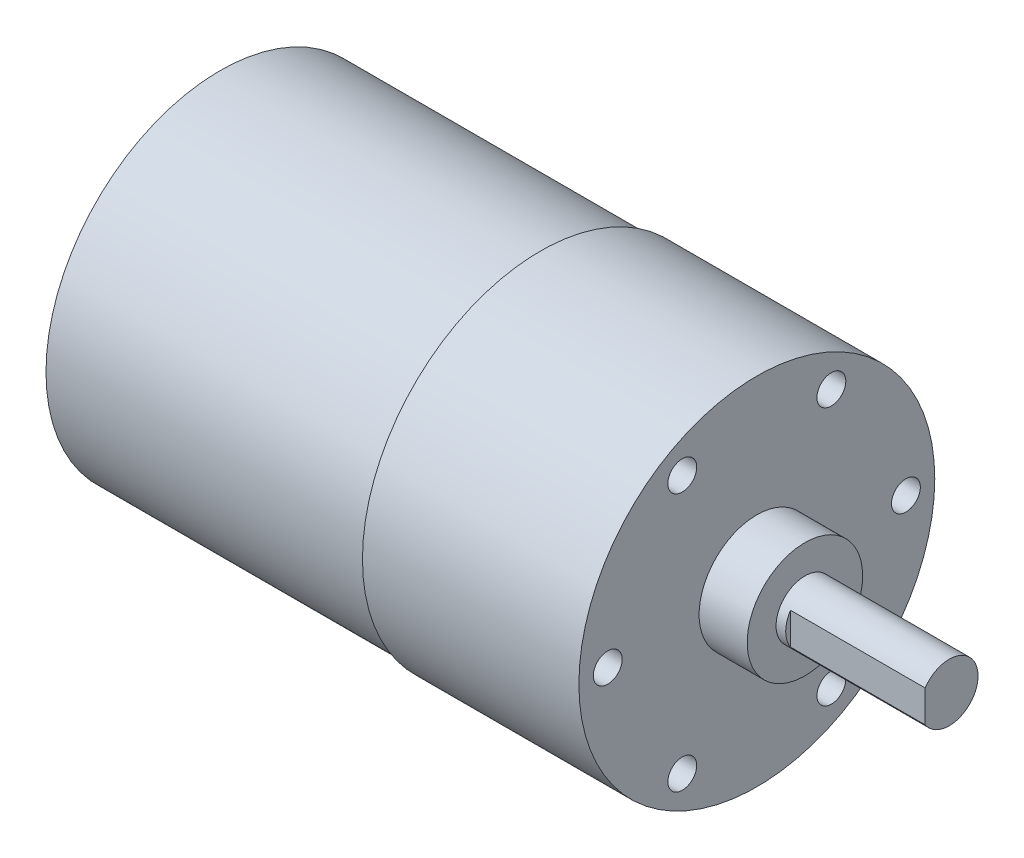
ISO-10303-21;
HEADER;
FILE_DESCRIPTION(('STEP AP214'),'2;1');
FILE_NAME('part.step','',(''),(''),'','','');
FILE_SCHEMA(('AUTOMOTIVE_DESIGN { 1 0 10303 214 1 1 1 1 }'));
ENDSEC;
DATA;
#1=APPLICATION_CONTEXT('core data for automotive mechanical design processes');
#2=APPLICATION_PROTOCOL_DEFINITION('international standard','automotive_design',2000,#1);
#3=PRODUCT_CONTEXT('',#1,'mechanical');
#4=PRODUCT('Part','Part','',(#3));
#5=PRODUCT_RELATED_PRODUCT_CATEGORY('part','',(#4));
#6=PRODUCT_DEFINITION_FORMATION('','',#4);
#7=PRODUCT_DEFINITION_CONTEXT('part definition',#1,'design');
#8=PRODUCT_DEFINITION('design','',#6,#7);
#9=PRODUCT_DEFINITION_SHAPE('','',#8);
#10=(LENGTH_UNIT() NAMED_UNIT(*) SI_UNIT(.MILLI.,.METRE.));
#11=(NAMED_UNIT(*) PLANE_ANGLE_UNIT() SI_UNIT($,.RADIAN.));
#12=(NAMED_UNIT(*) SI_UNIT($,.STERADIAN.) SOLID_ANGLE_UNIT());
#13=UNCERTAINTY_MEASURE_WITH_UNIT(LENGTH_MEASURE(1.E-05),#10,'distance_accuracy_value','');
#14=(GEOMETRIC_REPRESENTATION_CONTEXT(3) GLOBAL_UNCERTAINTY_ASSIGNED_CONTEXT((#13)) GLOBAL_UNIT_ASSIGNED_CONTEXT((#10,
#11,#12)) REPRESENTATION_CONTEXT('',''));
#15=CARTESIAN_POINT('',(0.,0.,0.));
#16=DIRECTION('',(0.,0.,1.));
#17=DIRECTION('',(1.,0.,0.));
#18=AXIS2_PLACEMENT_3D('',#15,#16,#17);
#19=CARTESIAN_POINT('',(-33.3,0.,0.));
#20=DIRECTION('',(-1.,0.,0.));
#21=DIRECTION('',(0.,0.,1.));
#22=AXIS2_PLACEMENT_3D('',#19,#20,#21);
#23=PLANE('',#22);
#24=CARTESIAN_POINT('',(-33.3,0.,0.));
#25=DIRECTION('',(-1.,0.,0.));
#26=DIRECTION('',(0.,0.,1.));
#27=AXIS2_PLACEMENT_3D('',#24,#25,#26);
#28=CIRCLE('',#27,18.1);
#29=CARTESIAN_POINT('',(-33.3,0.,18.1));
#30=VERTEX_POINT('',#29);
#31=EDGE_CURVE('E144',#30,#30,#28,.T.);
#32=ORIENTED_EDGE('',*,*,#31,.T.);
#33=EDGE_LOOP('',(#32));
#34=FACE_BOUND('',#33,.T.);
#35=DIRECTION('',(0.,-1.,0.));
#36=VECTOR('',#35,1.);
#37=CARTESIAN_POINT('',(-33.3,-5.1098556183302,-4.17805841734033));
#38=LINE('',#37,#36);
#39=CARTESIAN_POINT('',(-33.3,-5.1098556183302,-4.17805841734033));
#40=VERTEX_POINT('',#39);
#41=CARTESIAN_POINT('',(-33.3,-6.97345002030944,-4.17805841734033));
#42=VERTEX_POINT('',#41);
#43=EDGE_CURVE('E168',#40,#42,#38,.T.);
#44=ORIENTED_EDGE('',*,*,#43,.F.);
#45=DIRECTION('',(0.,0.,-1.));
#46=VECTOR('',#45,1.);
#47=CARTESIAN_POINT('',(-33.3,-5.1098556183302,-4.17805841734033));
#48=LINE('',#47,#46);
#49=CARTESIAN_POINT('',(-33.3,-5.1098556183302,5.20002954100684));
#50=VERTEX_POINT('',#49);
#51=EDGE_CURVE('E170',#50,#40,#48,.T.);
#52=ORIENTED_EDGE('',*,*,#51,.F.);
#53=DIRECTION('',(0.,1.,0.));
#54=VECTOR('',#53,1.);
#55=CARTESIAN_POINT('',(-33.3,-5.1098556183302,5.20002954100684));
#56=LINE('',#55,#54);
#57=CARTESIAN_POINT('',(-33.3,-6.97345002030944,5.20002954100684));
#58=VERTEX_POINT('',#57);
#59=EDGE_CURVE('E163',#58,#50,#56,.T.);
#60=ORIENTED_EDGE('',*,*,#59,.F.);
#61=DIRECTION('',(0.,0.,1.));
#62=VECTOR('',#61,1.);
#63=CARTESIAN_POINT('',(-33.3,-6.97345002030944,-4.17805841734033));
#64=LINE('',#63,#62);
#65=EDGE_CURVE('E165',#42,#58,#64,.T.);
#66=ORIENTED_EDGE('',*,*,#65,.F.);
#67=EDGE_LOOP('',(#44,#52,#60,#66));
#68=FACE_BOUND('',#67,.T.);
#69=DIRECTION('',(0.,-1.,0.));
#70=VECTOR('',#69,1.);
#71=CARTESIAN_POINT('',(-33.3,6.67287027805472,-4.17805841734033));
#72=LINE('',#71,#70);
#73=CARTESIAN_POINT('',(-33.3,6.67287027805472,-4.17805841734033));
#74=VERTEX_POINT('',#73);
#75=CARTESIAN_POINT('',(-33.3,4.92950777297736,-4.17805841734033));
#76=VERTEX_POINT('',#75);
#77=EDGE_CURVE('E555',#74,#76,#72,.T.);
#78=ORIENTED_EDGE('',*,*,#77,.F.);
#79=DIRECTION('',(0.,0.,-1.));
#80=VECTOR('',#79,1.);
#81=CARTESIAN_POINT('',(-33.3,6.67287027805472,-4.17805841734033));
#82=LINE('',#81,#80);
#83=CARTESIAN_POINT('',(-33.3,6.67287027805472,5.20002954100684));
#84=VERTEX_POINT('',#83);
#85=EDGE_CURVE('E142',#84,#74,#82,.T.);
#86=ORIENTED_EDGE('',*,*,#85,.F.);
#87=DIRECTION('',(0.,1.,0.));
#88=VECTOR('',#87,1.);
#89=CARTESIAN_POINT('',(-33.3,6.67287027805472,5.20002954100684));
#90=LINE('',#89,#88);
#91=CARTESIAN_POINT('',(-33.3,4.92950777297736,5.20002954100684));
#92=VERTEX_POINT('',#91);
#93=EDGE_CURVE('E138',#92,#84,#90,.T.);
#94=ORIENTED_EDGE('',*,*,#93,.F.);
#95=DIRECTION('',(0.,0.,1.));
#96=VECTOR('',#95,1.);
#97=CARTESIAN_POINT('',(-33.3,4.92950777297736,-4.17805841734033));
#98=LINE('',#97,#96);
#99=EDGE_CURVE('E557',#76,#92,#98,.T.);
#100=ORIENTED_EDGE('',*,*,#99,.F.);
#101=EDGE_LOOP('',(#78,#86,#94,#100));
#102=FACE_BOUND('',#101,.T.);
#103=ADVANCED_FACE('F39',(#34,#68,#102),#23,.T.);
#104=CARTESIAN_POINT('',(22.5,0.,0.));
#105=DIRECTION('',(-1.,0.,0.));
#106=DIRECTION('',(0.,0.,1.));
#107=AXIS2_PLACEMENT_3D('',#104,#105,#106);
#108=CYLINDRICAL_SURFACE('',#107,18.5);
#109=CARTESIAN_POINT('',(22.5,0.,0.));
#110=DIRECTION('',(1.,0.,0.));
#111=DIRECTION('',(0.,0.,-1.));
#112=AXIS2_PLACEMENT_3D('',#109,#110,#111);
#113=CIRCLE('',#112,18.5);
#114=CARTESIAN_POINT('',(22.5,0.,18.5));
#115=VERTEX_POINT('',#114);
#116=EDGE_CURVE('E203',#115,#115,#113,.T.);
#117=CARTESIAN_POINT('',(0.,0.,0.));
#118=DIRECTION('',(1.,0.,0.));
#119=DIRECTION('',(0.,0.,-1.));
#120=AXIS2_PLACEMENT_3D('',#117,#118,#119);
#121=CIRCLE('',#120,18.5);
#122=CARTESIAN_POINT('',(0.,0.,18.5));
#123=VERTEX_POINT('',#122);
#124=EDGE_CURVE('E43',#123,#123,#121,.T.);
#125=CARTESIAN_POINT('',(22.5,0.,18.5));
#126=CARTESIAN_POINT('',(22.265625,0.,18.5));
#127=CARTESIAN_POINT('',(22.03125,0.,18.5));
#128=CARTESIAN_POINT('',(21.5625,0.,18.5));
#129=CARTESIAN_POINT('',(21.328125,0.,18.5));
#130=CARTESIAN_POINT('',(20.859375,0.,18.5));
#131=CARTESIAN_POINT('',(20.625,0.,18.5));
#132=CARTESIAN_POINT('',(20.15625,0.,18.5));
#133=CARTESIAN_POINT('',(19.921875,0.,18.5));
#134=CARTESIAN_POINT('',(19.453125,0.,18.5));
#135=CARTESIAN_POINT('',(19.21875,0.,18.5));
#136=CARTESIAN_POINT('',(18.75,0.,18.5));
#137=CARTESIAN_POINT('',(18.515625,0.,18.5));
#138=CARTESIAN_POINT('',(18.046875,0.,18.5));
#139=CARTESIAN_POINT('',(17.8125,0.,18.5));
#140=CARTESIAN_POINT('',(17.34375,0.,18.5));
#141=CARTESIAN_POINT('',(17.109375,0.,18.5));
#142=CARTESIAN_POINT('',(16.640625,0.,18.5));
#143=CARTESIAN_POINT('',(16.40625,0.,18.5));
#144=CARTESIAN_POINT('',(15.9375,0.,18.5));
#145=CARTESIAN_POINT('',(15.703125,0.,18.5));
#146=CARTESIAN_POINT('',(15.234375,0.,18.5));
#147=CARTESIAN_POINT('',(15.,0.,18.5));
#148=CARTESIAN_POINT('',(14.53125,0.,18.5));
#149=CARTESIAN_POINT('',(14.296875,0.,18.5));
#150=CARTESIAN_POINT('',(13.828125,0.,18.5));
#151=CARTESIAN_POINT('',(13.59375,0.,18.5));
#152=CARTESIAN_POINT('',(13.125,0.,18.5));
#153=CARTESIAN_POINT('',(12.890625,0.,18.5));
#154=CARTESIAN_POINT('',(12.421875,0.,18.5));
#155=CARTESIAN_POINT('',(12.1875,0.,18.5));
#156=CARTESIAN_POINT('',(11.71875,0.,18.5));
#157=CARTESIAN_POINT('',(11.484375,0.,18.5));
#158=CARTESIAN_POINT('',(11.015625,0.,18.5));
#159=CARTESIAN_POINT('',(10.78125,0.,18.5));
#160=CARTESIAN_POINT('',(10.3125,0.,18.5));
#161=CARTESIAN_POINT('',(10.078125,0.,18.5));
#162=CARTESIAN_POINT('',(9.60937499999999,0.,18.5));
#163=CARTESIAN_POINT('',(9.375,0.,18.5));
#164=CARTESIAN_POINT('',(8.90625,0.,18.5));
#165=CARTESIAN_POINT('',(8.671875,0.,18.5));
#166=CARTESIAN_POINT('',(8.20312499999999,0.,18.5));
#167=CARTESIAN_POINT('',(7.96874999999999,0.,18.5));
#168=CARTESIAN_POINT('',(7.5,0.,18.5));
#169=CARTESIAN_POINT('',(7.265625,0.,18.5));
#170=CARTESIAN_POINT('',(6.796875,0.,18.5));
#171=CARTESIAN_POINT('',(6.5625,0.,18.5));
#172=CARTESIAN_POINT('',(6.09375,0.,18.5));
#173=CARTESIAN_POINT('',(5.859375,0.,18.5));
#174=CARTESIAN_POINT('',(5.390625,0.,18.5));
#175=CARTESIAN_POINT('',(5.15625,0.,18.5));
#176=CARTESIAN_POINT('',(4.6875,0.,18.5));
#177=CARTESIAN_POINT('',(4.453125,0.,18.5));
#178=CARTESIAN_POINT('',(3.984375,0.,18.5));
#179=CARTESIAN_POINT('',(3.75,0.,18.5));
#180=CARTESIAN_POINT('',(3.28125,0.,18.5));
#181=CARTESIAN_POINT('',(3.046875,0.,18.5));
#182=CARTESIAN_POINT('',(2.578125,0.,18.5));
#183=CARTESIAN_POINT('',(2.34375,0.,18.5));
#184=CARTESIAN_POINT('',(1.875,0.,18.5));
#185=CARTESIAN_POINT('',(1.640625,0.,18.5));
#186=CARTESIAN_POINT('',(1.171875,0.,18.5));
#187=CARTESIAN_POINT('',(0.937499999999996,0.,18.5));
#188=CARTESIAN_POINT('',(0.468749999999996,0.,18.5));
#189=CARTESIAN_POINT('',(0.234374999999996,0.,18.5));
#190=CARTESIAN_POINT('',(0.,0.,18.5));
#191=B_SPLINE_CURVE_WITH_KNOTS('',3,(#125,#126,#127,#128,#129,#130,#131,#132,#133,#134,#135,
#136,#137,#138,#139,#140,#141,#142,#143,#144,#145,#146,#147,#148,#149,#150,#151,#152,#153,#154,
#155,#156,#157,#158,#159,#160,#161,#162,#163,#164,#165,#166,#167,#168,#169,#170,#171,#172,#173,
#174,#175,#176,#177,#178,#179,#180,#181,#182,#183,#184,#185,#186,#187,#188,#189,#190),
.UNSPECIFIED.,.F.,.F.,(4,2,2,2,2,2,2,2,2,2,2,2,2,2,2,2,2,2,2,2,2,2,2,2,2,2,2,2,2,2,2,2,4),(0.,
0.703125000000002,1.40625,2.109375,2.8125,3.515625,4.21875,4.921875,5.625,6.328125,7.03125,
7.734375,8.4375,9.140625,9.84375,10.546875,11.25,11.953125,12.65625,13.359375,14.0625,14.765625,
15.46875,16.171875,16.875,17.578125,18.28125,18.984375,19.6875,20.390625,21.09375,21.796875,
22.5),.UNSPECIFIED.);
#192=EDGE_CURVE('BSEAM41',#115,#123,#191,.T.);
#193=ORIENTED_EDGE('',*,*,#116,.F.);
#194=ORIENTED_EDGE('',*,*,#124,.T.);
#195=ORIENTED_EDGE('',*,*,#192,.T.);
#196=ORIENTED_EDGE('',*,*,#192,.F.);
#197=EDGE_LOOP('',(#193,#195,#194,#196));
#198=FACE_BOUND('',#197,.T.);
#199=ADVANCED_FACE('F41',(#198),#108,.T.);
#200=CARTESIAN_POINT('',(22.5,0.,0.));
#201=DIRECTION('',(1.,0.,0.));
#202=DIRECTION('',(0.,0.,-1.));
#203=AXIS2_PLACEMENT_3D('',#200,#201,#202);
#204=PLANE('',#203);
#205=CARTESIAN_POINT('',(22.5,-1.08235921504137E-13,-15.5));
#206=DIRECTION('',(1.,0.,0.));
#207=DIRECTION('',(0.,0.,-1.));
#208=AXIS2_PLACEMENT_3D('',#205,#206,#207);
#209=CIRCLE('',#208,1.5);
#210=CARTESIAN_POINT('',(22.5,-1.08235921504137E-13,-17.));
#211=VERTEX_POINT('',#210);
#212=EDGE_CURVE('E516',#211,#211,#209,.T.);
#213=ORIENTED_EDGE('',*,*,#212,.F.);
#214=EDGE_LOOP('',(#213));
#215=FACE_BOUND('',#214,.T.);
#216=CARTESIAN_POINT('',(22.5,13.4233937586588,-7.75000000000006));
#217=DIRECTION('',(1.,0.,0.));
#218=DIRECTION('',(0.,0.,-1.));
#219=AXIS2_PLACEMENT_3D('',#216,#217,#218);
#220=CIRCLE('',#219,1.5);
#221=CARTESIAN_POINT('',(22.5,13.4233937586588,-9.25000000000006));
#222=VERTEX_POINT('',#221);
#223=EDGE_CURVE('E522',#222,#222,#220,.T.);
#224=ORIENTED_EDGE('',*,*,#223,.F.);
#225=EDGE_LOOP('',(#224));
#226=FACE_BOUND('',#225,.T.);
#227=CARTESIAN_POINT('',(22.5,13.4233937586588,7.74999999999997));
#228=DIRECTION('',(1.,0.,0.));
#229=DIRECTION('',(0.,0.,-1.));
#230=AXIS2_PLACEMENT_3D('',#227,#228,#229);
#231=CIRCLE('',#230,1.5);
#232=CARTESIAN_POINT('',(22.5,13.4233937586588,6.24999999999997));
#233=VERTEX_POINT('',#232);
#234=EDGE_CURVE('E546',#233,#233,#231,.T.);
#235=ORIENTED_EDGE('',*,*,#234,.F.);
#236=EDGE_LOOP('',(#235));
#237=FACE_BOUND('',#236,.T.);
#238=CARTESIAN_POINT('',(22.5,0.,15.5));
#239=DIRECTION('',(1.,0.,0.));
#240=DIRECTION('',(0.,0.,-1.));
#241=AXIS2_PLACEMENT_3D('',#238,#239,#240);
#242=CIRCLE('',#241,1.5);
#243=CARTESIAN_POINT('',(22.5,0.,14.));
#244=VERTEX_POINT('',#243);
#245=EDGE_CURVE('E540',#244,#244,#242,.T.);
#246=ORIENTED_EDGE('',*,*,#245,.F.);
#247=EDGE_LOOP('',(#246));
#248=FACE_BOUND('',#247,.T.);
#249=CARTESIAN_POINT('',(22.5,-13.4233937586587,7.75000000000016));
#250=DIRECTION('',(1.,0.,0.));
#251=DIRECTION('',(0.,0.,-1.));
#252=AXIS2_PLACEMENT_3D('',#249,#250,#251);
#253=CIRCLE('',#252,1.5);
#254=CARTESIAN_POINT('',(22.5,-13.4233937586587,6.25000000000016));
#255=VERTEX_POINT('',#254);
#256=EDGE_CURVE('E534',#255,#255,#253,.T.);
#257=ORIENTED_EDGE('',*,*,#256,.F.);
#258=EDGE_LOOP('',(#257));
#259=FACE_BOUND('',#258,.T.);
#260=CARTESIAN_POINT('',(22.5,-13.4233937586589,-7.74999999999987));
#261=DIRECTION('',(1.,0.,0.));
#262=DIRECTION('',(0.,0.,-1.));
#263=AXIS2_PLACEMENT_3D('',#260,#261,#262);
#264=CIRCLE('',#263,1.5);
#265=CARTESIAN_POINT('',(22.5,-13.4233937586589,-9.24999999999987));
#266=VERTEX_POINT('',#265);
#267=EDGE_CURVE('E519',#266,#266,#264,.T.);
#268=ORIENTED_EDGE('',*,*,#267,.F.);
#269=EDGE_LOOP('',(#268));
#270=FACE_BOUND('',#269,.T.);
#271=CARTESIAN_POINT('',(22.5,0.,0.));
#272=DIRECTION('',(1.,0.,0.));
#273=DIRECTION('',(0.,0.,-1.));
#274=AXIS2_PLACEMENT_3D('',#271,#272,#273);
#275=CIRCLE('',#274,6.);
#276=CARTESIAN_POINT('',(22.5,0.,-6.));
#277=VERTEX_POINT('',#276);
#278=EDGE_CURVE('E199',#277,#277,#275,.T.);
#279=ORIENTED_EDGE('',*,*,#278,.F.);
#280=EDGE_LOOP('',(#279));
#281=FACE_BOUND('',#280,.T.);
#282=ORIENTED_EDGE('',*,*,#116,.T.);
#283=EDGE_LOOP('',(#282));
#284=FACE_BOUND('',#283,.T.);
#285=ADVANCED_FACE('F214',(#215,#226,#237,#248,#259,#270,#281,#284),#204,.T.);
#286=CARTESIAN_POINT('',(0.,0.,0.));
#287=DIRECTION('',(1.,0.,0.));
#288=DIRECTION('',(0.,0.,-1.));
#289=AXIS2_PLACEMENT_3D('',#286,#287,#288);
#290=PLANE('',#289);
#291=CARTESIAN_POINT('',(0.,0.,0.));
#292=DIRECTION('',(-1.,0.,0.));
#293=DIRECTION('',(0.,0.,1.));
#294=AXIS2_PLACEMENT_3D('',#291,#292,#293);
#295=CIRCLE('',#294,18.1);
#296=CARTESIAN_POINT('',(0.,0.,18.1));
#297=VERTEX_POINT('',#296);
#298=EDGE_CURVE('E11',#297,#297,#295,.T.);
#299=ORIENTED_EDGE('',*,*,#298,.F.);
#300=EDGE_LOOP('',(#299));
#301=FACE_BOUND('',#300,.T.);
#302=ORIENTED_EDGE('',*,*,#124,.F.);
#303=EDGE_LOOP('',(#302));
#304=FACE_BOUND('',#303,.T.);
#305=ADVANCED_FACE('F211',(#301,#304),#290,.F.);
#306=CARTESIAN_POINT('',(27.5,0.,0.));
#307=DIRECTION('',(-1.,0.,0.));
#308=DIRECTION('',(0.,0.,1.));
#309=AXIS2_PLACEMENT_3D('',#306,#307,#308);
#310=CYLINDRICAL_SURFACE('',#309,6.);
#311=CARTESIAN_POINT('',(27.5,0.,0.));
#312=DIRECTION('',(1.,0.,0.));
#313=DIRECTION('',(0.,0.,-1.));
#314=AXIS2_PLACEMENT_3D('',#311,#312,#313);
#315=CIRCLE('',#314,6.);
#316=CARTESIAN_POINT('',(27.5,0.,-6.));
#317=VERTEX_POINT('',#316);
#318=EDGE_CURVE('E196',#317,#317,#315,.T.);
#319=ORIENTED_EDGE('',*,*,#318,.F.);
#320=EDGE_LOOP('',(#319));
#321=FACE_BOUND('',#320,.T.);
#322=ORIENTED_EDGE('',*,*,#278,.T.);
#323=EDGE_LOOP('',(#322));
#324=FACE_BOUND('',#323,.T.);
#325=ADVANCED_FACE('F213',(#321,#324),#310,.T.);
#326=CARTESIAN_POINT('',(27.5,0.,0.));
#327=DIRECTION('',(1.,0.,0.));
#328=DIRECTION('',(0.,0.,-1.));
#329=AXIS2_PLACEMENT_3D('',#326,#327,#328);
#330=PLANE('',#329);
#331=CARTESIAN_POINT('',(27.5,0.,0.));
#332=DIRECTION('',(1.,0.,0.));
#333=DIRECTION('',(0.,0.,-1.));
#334=AXIS2_PLACEMENT_3D('',#331,#332,#333);
#335=CIRCLE('',#334,3.);
#336=CARTESIAN_POINT('',(27.5,0.,-3.));
#337=VERTEX_POINT('',#336);
#338=EDGE_CURVE('E48',#337,#337,#335,.T.);
#339=ORIENTED_EDGE('',*,*,#338,.F.);
#340=EDGE_LOOP('',(#339));
#341=FACE_BOUND('',#340,.T.);
#342=ORIENTED_EDGE('',*,*,#318,.T.);
#343=EDGE_LOOP('',(#342));
#344=FACE_BOUND('',#343,.T.);
#345=ADVANCED_FACE('F221',(#341,#344),#330,.T.);
#346=CARTESIAN_POINT('',(42.5,0.,0.));
#347=DIRECTION('',(-1.,0.,0.));
#348=DIRECTION('',(0.,0.,1.));
#349=AXIS2_PLACEMENT_3D('',#346,#347,#348);
#350=CYLINDRICAL_SURFACE('',#349,3.);
#351=CARTESIAN_POINT('',(42.5,0.,0.));
#352=DIRECTION('',(1.,0.,0.));
#353=DIRECTION('',(0.,0.,-1.));
#354=AXIS2_PLACEMENT_3D('',#351,#352,#353);
#355=CIRCLE('',#354,3.);
#356=CARTESIAN_POINT('',(42.5,-1.6583123951777,2.5));
#357=VERTEX_POINT('',#356);
#358=CARTESIAN_POINT('',(42.5,1.6583123951777,2.5));
#359=VERTEX_POINT('',#358);
#360=EDGE_CURVE('E191',#357,#359,#355,.T.);
#361=ORIENTED_EDGE('',*,*,#360,.F.);
#362=DIRECTION('',(-1.,0.,0.));
#363=VECTOR('',#362,1.);
#364=CARTESIAN_POINT('',(151.763815632809,-1.6583123951777,2.5));
#365=LINE('',#364,#363);
#366=CARTESIAN_POINT('',(28.5,-1.6583123951777,2.5));
#367=VERTEX_POINT('',#366);
#368=EDGE_CURVE('E186',#357,#367,#365,.T.);
#369=ORIENTED_EDGE('',*,*,#368,.T.);
#370=CARTESIAN_POINT('',(28.5,0.,0.));
#371=DIRECTION('',(1.,0.,0.));
#372=DIRECTION('',(0.,0.,-1.));
#373=AXIS2_PLACEMENT_3D('',#370,#371,#372);
#374=CIRCLE('',#373,3.);
#375=CARTESIAN_POINT('',(28.5,1.6583123951777,2.5));
#376=VERTEX_POINT('',#375);
#377=EDGE_CURVE('E147',#376,#367,#374,.T.);
#378=ORIENTED_EDGE('',*,*,#377,.F.);
#379=DIRECTION('',(-1.,0.,0.));
#380=VECTOR('',#379,1.);
#381=CARTESIAN_POINT('',(151.763815632809,1.6583123951777,2.5));
#382=LINE('',#381,#380);
#383=EDGE_CURVE('E183',#359,#376,#382,.T.);
#384=ORIENTED_EDGE('',*,*,#383,.F.);
#385=EDGE_LOOP('',(#361,#369,#378,#384));
#386=FACE_BOUND('',#385,.T.);
#387=ORIENTED_EDGE('',*,*,#338,.T.);
#388=EDGE_LOOP('',(#387));
#389=FACE_BOUND('',#388,.T.);
#390=ADVANCED_FACE('F255',(#386,#389),#350,.T.);
#391=CARTESIAN_POINT('',(42.5,0.,0.));
#392=DIRECTION('',(1.,0.,0.));
#393=DIRECTION('',(0.,0.,-1.));
#394=AXIS2_PLACEMENT_3D('',#391,#392,#393);
#395=PLANE('',#394);
#396=DIRECTION('',(0.,1.,0.));
#397=VECTOR('',#396,1.);
#398=CARTESIAN_POINT('',(42.5,-1.6583123951777,2.5));
#399=LINE('',#398,#397);
#400=EDGE_CURVE('E188',#357,#359,#399,.T.);
#401=ORIENTED_EDGE('',*,*,#400,.F.);
#402=ORIENTED_EDGE('',*,*,#360,.T.);
#403=EDGE_LOOP('',(#401,#402));
#404=FACE_BOUND('',#403,.T.);
#405=ADVANCED_FACE('F249',(#404),#395,.T.);
#406=CARTESIAN_POINT('',(151.763815632809,-1.6583123951777,2.5));
#407=DIRECTION('',(0.,0.,1.));
#408=DIRECTION('',(1.,0.,0.));
#409=AXIS2_PLACEMENT_3D('',#406,#407,#408);
#410=PLANE('',#409);
#411=ORIENTED_EDGE('',*,*,#368,.F.);
#412=ORIENTED_EDGE('',*,*,#400,.T.);
#413=ORIENTED_EDGE('',*,*,#383,.T.);
#414=DIRECTION('',(0.,1.,0.));
#415=VECTOR('',#414,1.);
#416=CARTESIAN_POINT('',(28.5,-1.6583123951777,2.5));
#417=LINE('',#416,#415);
#418=EDGE_CURVE('E180',#367,#376,#417,.T.);
#419=ORIENTED_EDGE('',*,*,#418,.F.);
#420=EDGE_LOOP('',(#411,#412,#413,#419));
#421=FACE_BOUND('',#420,.T.);
#422=ADVANCED_FACE('F246',(#421),#410,.T.);
#423=CARTESIAN_POINT('',(28.5,0.,0.));
#424=DIRECTION('',(1.,0.,0.));
#425=DIRECTION('',(0.,0.,-1.));
#426=AXIS2_PLACEMENT_3D('',#423,#424,#425);
#427=PLANE('',#426);
#428=ORIENTED_EDGE('',*,*,#418,.T.);
#429=ORIENTED_EDGE('',*,*,#377,.T.);
#430=EDGE_LOOP('',(#428,#429));
#431=FACE_BOUND('',#430,.T.);
#432=ADVANCED_FACE('F244',(#431),#427,.T.);
#433=CARTESIAN_POINT('',(-33.3,0.,0.));
#434=DIRECTION('',(1.,0.,0.));
#435=DIRECTION('',(0.,0.,-1.));
#436=AXIS2_PLACEMENT_3D('',#433,#434,#435);
#437=CYLINDRICAL_SURFACE('',#436,18.1);
#438=ORIENTED_EDGE('',*,*,#31,.F.);
#439=EDGE_LOOP('',(#438));
#440=FACE_BOUND('',#439,.T.);
#441=ORIENTED_EDGE('',*,*,#298,.T.);
#442=EDGE_LOOP('',(#441));
#443=FACE_BOUND('',#442,.T.);
#444=ADVANCED_FACE('F241',(#440,#443),#437,.T.);
#445=CARTESIAN_POINT('',(-37.3,-5.1098556183302,-4.17805841734033));
#446=DIRECTION('',(0.,-1.,0.));
#447=DIRECTION('',(0.,0.,-1.));
#448=AXIS2_PLACEMENT_3D('',#445,#446,#447);
#449=PLANE('',#448);
#450=ORIENTED_EDGE('',*,*,#51,.T.);
#451=DIRECTION('',(1.,0.,0.));
#452=VECTOR('',#451,1.);
#453=CARTESIAN_POINT('',(-37.3,-5.1098556183302,-4.17805841734033));
#454=LINE('',#453,#452);
#455=CARTESIAN_POINT('',(-37.3,-5.1098556183302,-4.17805841734033));
#456=VERTEX_POINT('',#455);
#457=EDGE_CURVE('E152',#456,#40,#454,.T.);
#458=ORIENTED_EDGE('',*,*,#457,.F.);
#459=DIRECTION('',(0.,0.,-1.));
#460=VECTOR('',#459,1.);
#461=CARTESIAN_POINT('',(-37.3,-5.1098556183302,-4.17805841734033));
#462=LINE('',#461,#460);
#463=CARTESIAN_POINT('',(-37.3,-5.1098556183302,5.20002954100684));
#464=VERTEX_POINT('',#463);
#465=EDGE_CURVE('E166',#464,#456,#462,.T.);
#466=ORIENTED_EDGE('',*,*,#465,.F.);
#467=DIRECTION('',(1.,0.,0.));
#468=VECTOR('',#467,1.);
#469=CARTESIAN_POINT('',(-37.3,-5.1098556183302,5.20002954100684));
#470=LINE('',#469,#468);
#471=EDGE_CURVE('E159',#464,#50,#470,.T.);
#472=ORIENTED_EDGE('',*,*,#471,.T.);
#473=EDGE_LOOP('',(#450,#458,#466,#472));
#474=FACE_BOUND('',#473,.T.);
#475=ADVANCED_FACE('F243',(#474),#449,.F.);
#476=CARTESIAN_POINT('',(-37.3,-5.1098556183302,-4.17805841734033));
#477=DIRECTION('',(0.,0.,1.));
#478=DIRECTION('',(1.,0.,0.));
#479=AXIS2_PLACEMENT_3D('',#476,#477,#478);
#480=PLANE('',#479);
#481=ORIENTED_EDGE('',*,*,#43,.T.);
#482=DIRECTION('',(1.,0.,0.));
#483=VECTOR('',#482,1.);
#484=CARTESIAN_POINT('',(-37.3,-6.97345002030944,-4.17805841734033));
#485=LINE('',#484,#483);
#486=CARTESIAN_POINT('',(-37.3,-6.97345002030944,-4.17805841734033));
#487=VERTEX_POINT('',#486);
#488=EDGE_CURVE('E154',#487,#42,#485,.T.);
#489=ORIENTED_EDGE('',*,*,#488,.F.);
#490=DIRECTION('',(0.,-1.,0.));
#491=VECTOR('',#490,1.);
#492=CARTESIAN_POINT('',(-37.3,-5.1098556183302,-4.17805841734033));
#493=LINE('',#492,#491);
#494=EDGE_CURVE('E176',#456,#487,#493,.T.);
#495=ORIENTED_EDGE('',*,*,#494,.F.);
#496=ORIENTED_EDGE('',*,*,#457,.T.);
#497=EDGE_LOOP('',(#481,#489,#495,#496));
#498=FACE_BOUND('',#497,.T.);
#499=ADVANCED_FACE('F312',(#498),#480,.F.);
#500=CARTESIAN_POINT('',(-37.3,-6.97345002030944,-4.17805841734033));
#501=DIRECTION('',(0.,1.,0.));
#502=DIRECTION('',(0.,0.,1.));
#503=AXIS2_PLACEMENT_3D('',#500,#501,#502);
#504=PLANE('',#503);
#505=ORIENTED_EDGE('',*,*,#65,.T.);
#506=DIRECTION('',(1.,0.,0.));
#507=VECTOR('',#506,1.);
#508=CARTESIAN_POINT('',(-37.3,-6.97345002030944,5.20002954100684));
#509=LINE('',#508,#507);
#510=CARTESIAN_POINT('',(-37.3,-6.97345002030944,5.20002954100684));
#511=VERTEX_POINT('',#510);
#512=EDGE_CURVE('E64',#511,#58,#509,.T.);
#513=ORIENTED_EDGE('',*,*,#512,.F.);
#514=DIRECTION('',(0.,0.,1.));
#515=VECTOR('',#514,1.);
#516=CARTESIAN_POINT('',(-37.3,-6.97345002030944,-4.17805841734033));
#517=LINE('',#516,#515);
#518=EDGE_CURVE('E174',#487,#511,#517,.T.);
#519=ORIENTED_EDGE('',*,*,#518,.F.);
#520=ORIENTED_EDGE('',*,*,#488,.T.);
#521=EDGE_LOOP('',(#505,#513,#519,#520));
#522=FACE_BOUND('',#521,.T.);
#523=ADVANCED_FACE('F322',(#522),#504,.F.);
#524=CARTESIAN_POINT('',(-37.3,-5.1098556183302,5.20002954100684));
#525=DIRECTION('',(0.,0.,-1.));
#526=DIRECTION('',(-1.,0.,0.));
#527=AXIS2_PLACEMENT_3D('',#524,#525,#526);
#528=PLANE('',#527);
#529=ORIENTED_EDGE('',*,*,#59,.T.);
#530=ORIENTED_EDGE('',*,*,#471,.F.);
#531=DIRECTION('',(0.,1.,0.));
#532=VECTOR('',#531,1.);
#533=CARTESIAN_POINT('',(-37.3,-5.1098556183302,5.20002954100684));
#534=LINE('',#533,#532);
#535=EDGE_CURVE('E162',#511,#464,#534,.T.);
#536=ORIENTED_EDGE('',*,*,#535,.F.);
#537=ORIENTED_EDGE('',*,*,#512,.T.);
#538=EDGE_LOOP('',(#529,#530,#536,#537));
#539=FACE_BOUND('',#538,.T.);
#540=ADVANCED_FACE('F332',(#539),#528,.F.);
#541=CARTESIAN_POINT('',(-37.3,0.,0.));
#542=DIRECTION('',(1.,0.,0.));
#543=DIRECTION('',(0.,0.,-1.));
#544=AXIS2_PLACEMENT_3D('',#541,#542,#543);
#545=PLANE('',#544);
#546=ORIENTED_EDGE('',*,*,#465,.T.);
#547=ORIENTED_EDGE('',*,*,#494,.T.);
#548=ORIENTED_EDGE('',*,*,#518,.T.);
#549=ORIENTED_EDGE('',*,*,#535,.T.);
#550=EDGE_LOOP('',(#546,#547,#548,#549));
#551=FACE_BOUND('',#550,.T.);
#552=ADVANCED_FACE('F239',(#551),#545,.F.);
#553=CARTESIAN_POINT('',(-37.3,6.67287027805472,-4.17805841734033));
#554=DIRECTION('',(0.,-1.,0.));
#555=DIRECTION('',(0.,0.,-1.));
#556=AXIS2_PLACEMENT_3D('',#553,#554,#555);
#557=PLANE('',#556);
#558=ORIENTED_EDGE('',*,*,#85,.T.);
#559=DIRECTION('',(1.,0.,0.));
#560=VECTOR('',#559,1.);
#561=CARTESIAN_POINT('',(-37.3,6.67287027805472,-4.17805841734033));
#562=LINE('',#561,#560);
#563=CARTESIAN_POINT('',(-37.3,6.67287027805472,-4.17805841734033));
#564=VERTEX_POINT('',#563);
#565=EDGE_CURVE('E123',#564,#74,#562,.T.);
#566=ORIENTED_EDGE('',*,*,#565,.F.);
#567=DIRECTION('',(0.,0.,-1.));
#568=VECTOR('',#567,1.);
#569=CARTESIAN_POINT('',(-37.3,6.67287027805472,-4.17805841734033));
#570=LINE('',#569,#568);
#571=CARTESIAN_POINT('',(-37.3,6.67287027805472,5.20002954100684));
#572=VERTEX_POINT('',#571);
#573=EDGE_CURVE('E130',#572,#564,#570,.T.);
#574=ORIENTED_EDGE('',*,*,#573,.F.);
#575=DIRECTION('',(1.,0.,0.));
#576=VECTOR('',#575,1.);
#577=CARTESIAN_POINT('',(-37.3,6.67287027805472,5.20002954100684));
#578=LINE('',#577,#576);
#579=EDGE_CURVE('E553',#572,#84,#578,.T.);
#580=ORIENTED_EDGE('',*,*,#579,.T.);
#581=EDGE_LOOP('',(#558,#566,#574,#580));
#582=FACE_BOUND('',#581,.T.);
#583=ADVANCED_FACE('F140',(#582),#557,.F.);
#584=CARTESIAN_POINT('',(-37.3,6.67287027805472,-4.17805841734033));
#585=DIRECTION('',(0.,0.,1.));
#586=DIRECTION('',(1.,0.,0.));
#587=AXIS2_PLACEMENT_3D('',#584,#585,#586);
#588=PLANE('',#587);
#589=ORIENTED_EDGE('',*,*,#77,.T.);
#590=DIRECTION('',(1.,0.,0.));
#591=VECTOR('',#590,1.);
#592=CARTESIAN_POINT('',(-37.3,4.92950777297736,-4.17805841734033));
#593=LINE('',#592,#591);
#594=CARTESIAN_POINT('',(-37.3,4.92950777297736,-4.17805841734033));
#595=VERTEX_POINT('',#594);
#596=EDGE_CURVE('E126',#595,#76,#593,.T.);
#597=ORIENTED_EDGE('',*,*,#596,.F.);
#598=DIRECTION('',(0.,-1.,0.));
#599=VECTOR('',#598,1.);
#600=CARTESIAN_POINT('',(-37.3,6.67287027805472,-4.17805841734033));
#601=LINE('',#600,#599);
#602=EDGE_CURVE('E119',#564,#595,#601,.T.);
#603=ORIENTED_EDGE('',*,*,#602,.F.);
#604=ORIENTED_EDGE('',*,*,#565,.T.);
#605=EDGE_LOOP('',(#589,#597,#603,#604));
#606=FACE_BOUND('',#605,.T.);
#607=ADVANCED_FACE('F121',(#606),#588,.F.);
#608=CARTESIAN_POINT('',(-37.3,4.92950777297736,-4.17805841734033));
#609=DIRECTION('',(0.,1.,0.));
#610=DIRECTION('',(0.,0.,1.));
#611=AXIS2_PLACEMENT_3D('',#608,#609,#610);
#612=PLANE('',#611);
#613=ORIENTED_EDGE('',*,*,#99,.T.);
#614=DIRECTION('',(1.,0.,0.));
#615=VECTOR('',#614,1.);
#616=CARTESIAN_POINT('',(-37.3,4.92950777297736,5.20002954100684));
#617=LINE('',#616,#615);
#618=CARTESIAN_POINT('',(-37.3,4.92950777297736,5.20002954100684));
#619=VERTEX_POINT('',#618);
#620=EDGE_CURVE('E56',#619,#92,#617,.T.);
#621=ORIENTED_EDGE('',*,*,#620,.F.);
#622=DIRECTION('',(0.,0.,1.));
#623=VECTOR('',#622,1.);
#624=CARTESIAN_POINT('',(-37.3,4.92950777297736,-4.17805841734033));
#625=LINE('',#624,#623);
#626=EDGE_CURVE('E129',#595,#619,#625,.T.);
#627=ORIENTED_EDGE('',*,*,#626,.F.);
#628=ORIENTED_EDGE('',*,*,#596,.T.);
#629=EDGE_LOOP('',(#613,#621,#627,#628));
#630=FACE_BOUND('',#629,.T.);
#631=ADVANCED_FACE('F365',(#630),#612,.F.);
#632=CARTESIAN_POINT('',(-37.3,6.67287027805472,5.20002954100684));
#633=DIRECTION('',(0.,0.,-1.));
#634=DIRECTION('',(-1.,0.,0.));
#635=AXIS2_PLACEMENT_3D('',#632,#633,#634);
#636=PLANE('',#635);
#637=ORIENTED_EDGE('',*,*,#93,.T.);
#638=ORIENTED_EDGE('',*,*,#579,.F.);
#639=DIRECTION('',(0.,1.,0.));
#640=VECTOR('',#639,1.);
#641=CARTESIAN_POINT('',(-37.3,6.67287027805472,5.20002954100684));
#642=LINE('',#641,#640);
#643=EDGE_CURVE('E134',#619,#572,#642,.T.);
#644=ORIENTED_EDGE('',*,*,#643,.F.);
#645=ORIENTED_EDGE('',*,*,#620,.T.);
#646=EDGE_LOOP('',(#637,#638,#644,#645));
#647=FACE_BOUND('',#646,.T.);
#648=ADVANCED_FACE('F374',(#647),#636,.F.);
#649=CARTESIAN_POINT('',(-37.3,0.,0.));
#650=DIRECTION('',(1.,0.,0.));
#651=DIRECTION('',(0.,0.,-1.));
#652=AXIS2_PLACEMENT_3D('',#649,#650,#651);
#653=PLANE('',#652);
#654=ORIENTED_EDGE('',*,*,#573,.T.);
#655=ORIENTED_EDGE('',*,*,#602,.T.);
#656=ORIENTED_EDGE('',*,*,#626,.T.);
#657=ORIENTED_EDGE('',*,*,#643,.T.);
#658=EDGE_LOOP('',(#654,#655,#656,#657));
#659=FACE_BOUND('',#658,.T.);
#660=ADVANCED_FACE('F133',(#659),#653,.F.);
#661=CARTESIAN_POINT('',(17.5,-13.4233937586589,-7.74999999999987));
#662=DIRECTION('',(1.,0.,0.));
#663=DIRECTION('',(0.,0.,-1.));
#664=AXIS2_PLACEMENT_3D('',#661,#662,#663);
#665=CYLINDRICAL_SURFACE('',#664,1.5);
#666=CARTESIAN_POINT('',(17.5,-13.4233937586589,-7.74999999999987));
#667=DIRECTION('',(1.,0.,0.));
#668=DIRECTION('',(0.,0.,-1.));
#669=AXIS2_PLACEMENT_3D('',#666,#667,#668);
#670=CIRCLE('',#669,1.5);
#671=CARTESIAN_POINT('',(17.5,-13.4233937586589,-9.24999999999987));
#672=VERTEX_POINT('',#671);
#673=EDGE_CURVE('E531',#672,#672,#670,.T.);
#674=ORIENTED_EDGE('',*,*,#673,.F.);
#675=EDGE_LOOP('',(#674));
#676=FACE_BOUND('',#675,.T.);
#677=ORIENTED_EDGE('',*,*,#267,.T.);
#678=EDGE_LOOP('',(#677));
#679=FACE_BOUND('',#678,.T.);
#680=ADVANCED_FACE('F392',(#676,#679),#665,.F.);
#681=CARTESIAN_POINT('',(17.5,-13.4233937586589,-7.74999999999987));
#682=DIRECTION('',(1.,0.,0.));
#683=DIRECTION('',(0.,0.,-1.));
#684=AXIS2_PLACEMENT_3D('',#681,#682,#683);
#685=PLANE('',#684);
#686=ORIENTED_EDGE('',*,*,#673,.T.);
#687=EDGE_LOOP('',(#686));
#688=FACE_BOUND('',#687,.T.);
#689=ADVANCED_FACE('F401',(#688),#685,.T.);
#690=CARTESIAN_POINT('',(17.5,-13.4233937586587,7.75000000000016));
#691=DIRECTION('',(1.,0.,0.));
#692=DIRECTION('',(0.,0.,-1.));
#693=AXIS2_PLACEMENT_3D('',#690,#691,#692);
#694=CYLINDRICAL_SURFACE('',#693,1.5);
#695=CARTESIAN_POINT('',(17.5,-13.4233937586587,7.75000000000016));
#696=DIRECTION('',(1.,0.,0.));
#697=DIRECTION('',(0.,0.,-1.));
#698=AXIS2_PLACEMENT_3D('',#695,#696,#697);
#699=CIRCLE('',#698,1.5);
#700=CARTESIAN_POINT('',(17.5,-13.4233937586587,6.25000000000016));
#701=VERTEX_POINT('',#700);
#702=EDGE_CURVE('E537',#701,#701,#699,.T.);
#703=ORIENTED_EDGE('',*,*,#702,.F.);
#704=EDGE_LOOP('',(#703));
#705=FACE_BOUND('',#704,.T.);
#706=ORIENTED_EDGE('',*,*,#256,.T.);
#707=EDGE_LOOP('',(#706));
#708=FACE_BOUND('',#707,.T.);
#709=ADVANCED_FACE('F411',(#705,#708),#694,.F.);
#710=CARTESIAN_POINT('',(17.5,-13.4233937586587,7.75000000000016));
#711=DIRECTION('',(1.,0.,0.));
#712=DIRECTION('',(0.,0.,-1.));
#713=AXIS2_PLACEMENT_3D('',#710,#711,#712);
#714=PLANE('',#713);
#715=ORIENTED_EDGE('',*,*,#702,.T.);
#716=EDGE_LOOP('',(#715));
#717=FACE_BOUND('',#716,.T.);
#718=ADVANCED_FACE('F421',(#717),#714,.T.);
#719=CARTESIAN_POINT('',(17.5,0.,15.5));
#720=DIRECTION('',(1.,0.,0.));
#721=DIRECTION('',(0.,0.,-1.));
#722=AXIS2_PLACEMENT_3D('',#719,#720,#721);
#723=CYLINDRICAL_SURFACE('',#722,1.5);
#724=CARTESIAN_POINT('',(17.5,0.,15.5));
#725=DIRECTION('',(1.,0.,0.));
#726=DIRECTION('',(0.,0.,-1.));
#727=AXIS2_PLACEMENT_3D('',#724,#725,#726);
#728=CIRCLE('',#727,1.5);
#729=CARTESIAN_POINT('',(17.5,0.,14.));
#730=VERTEX_POINT('',#729);
#731=EDGE_CURVE('E543',#730,#730,#728,.T.);
#732=ORIENTED_EDGE('',*,*,#731,.F.);
#733=EDGE_LOOP('',(#732));
#734=FACE_BOUND('',#733,.T.);
#735=ORIENTED_EDGE('',*,*,#245,.T.);
#736=EDGE_LOOP('',(#735));
#737=FACE_BOUND('',#736,.T.);
#738=ADVANCED_FACE('F431',(#734,#737),#723,.F.);
#739=CARTESIAN_POINT('',(17.5,0.,15.5));
#740=DIRECTION('',(1.,0.,0.));
#741=DIRECTION('',(0.,0.,-1.));
#742=AXIS2_PLACEMENT_3D('',#739,#740,#741);
#743=PLANE('',#742);
#744=ORIENTED_EDGE('',*,*,#731,.T.);
#745=EDGE_LOOP('',(#744));
#746=FACE_BOUND('',#745,.T.);
#747=ADVANCED_FACE('F441',(#746),#743,.T.);
#748=CARTESIAN_POINT('',(17.5,13.4233937586588,7.74999999999997));
#749=DIRECTION('',(1.,0.,0.));
#750=DIRECTION('',(0.,0.,-1.));
#751=AXIS2_PLACEMENT_3D('',#748,#749,#750);
#752=CYLINDRICAL_SURFACE('',#751,1.5);
#753=CARTESIAN_POINT('',(17.5,13.4233937586588,7.74999999999997));
#754=DIRECTION('',(1.,0.,0.));
#755=DIRECTION('',(0.,0.,-1.));
#756=AXIS2_PLACEMENT_3D('',#753,#754,#755);
#757=CIRCLE('',#756,1.5);
#758=CARTESIAN_POINT('',(17.5,13.4233937586588,6.24999999999997));
#759=VERTEX_POINT('',#758);
#760=EDGE_CURVE('E525',#759,#759,#757,.T.);
#761=ORIENTED_EDGE('',*,*,#760,.F.);
#762=EDGE_LOOP('',(#761));
#763=FACE_BOUND('',#762,.T.);
#764=ORIENTED_EDGE('',*,*,#234,.T.);
#765=EDGE_LOOP('',(#764));
#766=FACE_BOUND('',#765,.T.);
#767=ADVANCED_FACE('F451',(#763,#766),#752,.F.);
#768=CARTESIAN_POINT('',(17.5,13.4233937586588,7.74999999999997));
#769=DIRECTION('',(1.,0.,0.));
#770=DIRECTION('',(0.,0.,-1.));
#771=AXIS2_PLACEMENT_3D('',#768,#769,#770);
#772=PLANE('',#771);
#773=ORIENTED_EDGE('',*,*,#760,.T.);
#774=EDGE_LOOP('',(#773));
#775=FACE_BOUND('',#774,.T.);
#776=ADVANCED_FACE('F461',(#775),#772,.T.);
#777=CARTESIAN_POINT('',(17.5,13.4233937586588,-7.75000000000006));
#778=DIRECTION('',(1.,0.,0.));
#779=DIRECTION('',(0.,0.,-1.));
#780=AXIS2_PLACEMENT_3D('',#777,#778,#779);
#781=CYLINDRICAL_SURFACE('',#780,1.5);
#782=CARTESIAN_POINT('',(17.5,13.4233937586588,-7.75000000000006));
#783=DIRECTION('',(1.,0.,0.));
#784=DIRECTION('',(0.,0.,-1.));
#785=AXIS2_PLACEMENT_3D('',#782,#783,#784);
#786=CIRCLE('',#785,1.5);
#787=CARTESIAN_POINT('',(17.5,13.4233937586588,-9.25000000000006));
#788=VERTEX_POINT('',#787);
#789=EDGE_CURVE('E526',#788,#788,#786,.T.);
#790=ORIENTED_EDGE('',*,*,#789,.F.);
#791=EDGE_LOOP('',(#790));
#792=FACE_BOUND('',#791,.T.);
#793=ORIENTED_EDGE('',*,*,#223,.T.);
#794=EDGE_LOOP('',(#793));
#795=FACE_BOUND('',#794,.T.);
#796=ADVANCED_FACE('F471',(#792,#795),#781,.F.);
#797=CARTESIAN_POINT('',(17.5,13.4233937586588,-7.75000000000006));
#798=DIRECTION('',(1.,0.,0.));
#799=DIRECTION('',(0.,0.,-1.));
#800=AXIS2_PLACEMENT_3D('',#797,#798,#799);
#801=PLANE('',#800);
#802=ORIENTED_EDGE('',*,*,#789,.T.);
#803=EDGE_LOOP('',(#802));
#804=FACE_BOUND('',#803,.T.);
#805=ADVANCED_FACE('F481',(#804),#801,.T.);
#806=CARTESIAN_POINT('',(17.5,-1.08235921504137E-13,-15.5));
#807=DIRECTION('',(1.,0.,0.));
#808=DIRECTION('',(0.,0.,-1.));
#809=AXIS2_PLACEMENT_3D('',#806,#807,#808);
#810=CYLINDRICAL_SURFACE('',#809,1.5);
#811=CARTESIAN_POINT('',(17.5,-1.08235921504137E-13,-15.5));
#812=DIRECTION('',(1.,0.,0.));
#813=DIRECTION('',(0.,0.,-1.));
#814=AXIS2_PLACEMENT_3D('',#811,#812,#813);
#815=CIRCLE('',#814,1.5);
#816=CARTESIAN_POINT('',(17.5,-1.08235921504137E-13,-17.));
#817=VERTEX_POINT('',#816);
#818=EDGE_CURVE('E155',#817,#817,#815,.T.);
#819=ORIENTED_EDGE('',*,*,#818,.F.);
#820=EDGE_LOOP('',(#819));
#821=FACE_BOUND('',#820,.T.);
#822=ORIENTED_EDGE('',*,*,#212,.T.);
#823=EDGE_LOOP('',(#822));
#824=FACE_BOUND('',#823,.T.);
#825=ADVANCED_FACE('F491',(#821,#824),#810,.F.);
#826=CARTESIAN_POINT('',(17.5,-1.08235921504137E-13,-15.5));
#827=DIRECTION('',(1.,0.,0.));
#828=DIRECTION('',(0.,0.,-1.));
#829=AXIS2_PLACEMENT_3D('',#826,#827,#828);
#830=PLANE('',#829);
#831=ORIENTED_EDGE('',*,*,#818,.T.);
#832=EDGE_LOOP('',(#831));
#833=FACE_BOUND('',#832,.T.);
#834=ADVANCED_FACE('F501',(#833),#830,.T.);
#835=CLOSED_SHELL('',(#103,#199,#285,#305,#325,#345,#390,#405,#422,#432,#444,#475,#499,#523,
#540,#552,#583,#607,#631,#648,#660,#680,#689,#709,#718,#738,#747,#767,#776,#796,#805,#825,#834));
#836=MANIFOLD_SOLID_BREP('B2',#835);
#837=ADVANCED_BREP_SHAPE_REPRESENTATION('',(#18,#836),#14);
#838=SHAPE_DEFINITION_REPRESENTATION(#9,#837);
ENDSEC;
END-ISO-10303-21;
